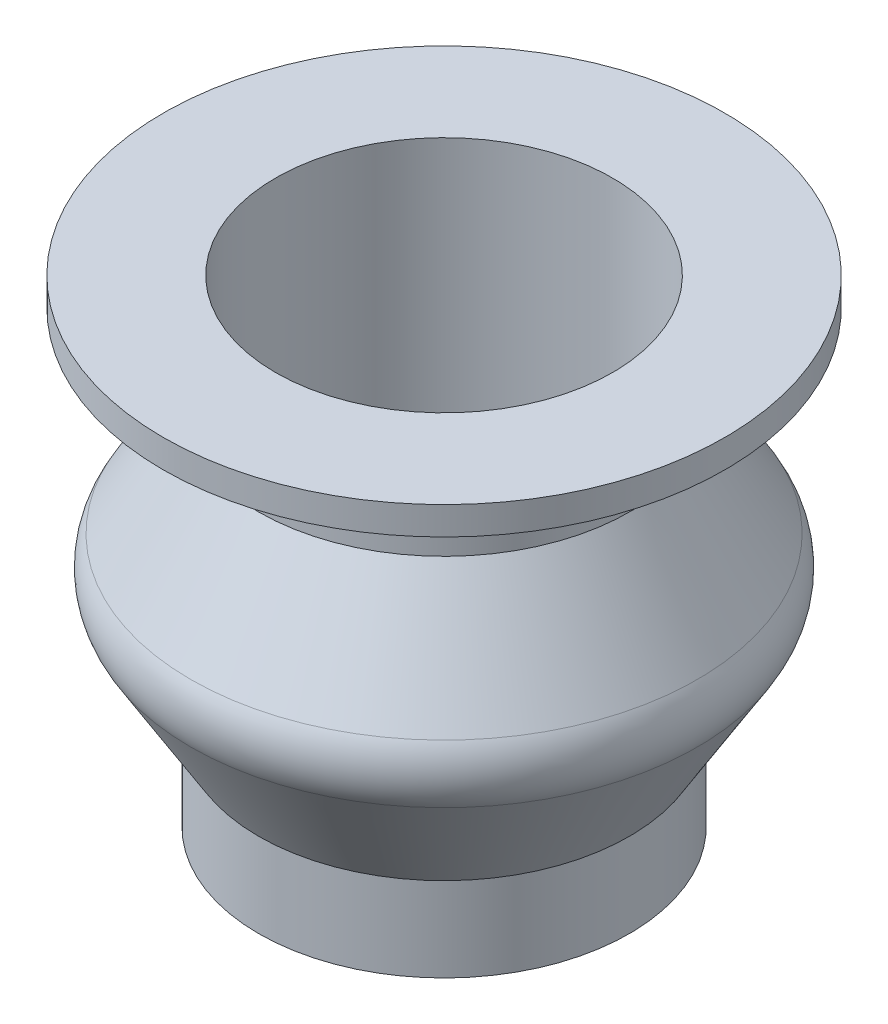
ISO-10303-21;
HEADER;
FILE_DESCRIPTION(('STEP AP214'),'2;1');
FILE_NAME('part.step','',(''),(''),'','','');
FILE_SCHEMA(('AUTOMOTIVE_DESIGN { 1 0 10303 214 1 1 1 1 }'));
ENDSEC;
DATA;
#1=APPLICATION_CONTEXT('core data for automotive mechanical design processes');
#2=APPLICATION_PROTOCOL_DEFINITION('international standard','automotive_design',2000,#1);
#3=PRODUCT_CONTEXT('',#1,'mechanical');
#4=PRODUCT('Part','Part','',(#3));
#5=PRODUCT_RELATED_PRODUCT_CATEGORY('part','',(#4));
#6=PRODUCT_DEFINITION_FORMATION('','',#4);
#7=PRODUCT_DEFINITION_CONTEXT('part definition',#1,'design');
#8=PRODUCT_DEFINITION('design','',#6,#7);
#9=PRODUCT_DEFINITION_SHAPE('','',#8);
#10=(LENGTH_UNIT() NAMED_UNIT(*) SI_UNIT(.MILLI.,.METRE.));
#11=(NAMED_UNIT(*) PLANE_ANGLE_UNIT() SI_UNIT($,.RADIAN.));
#12=(NAMED_UNIT(*) SI_UNIT($,.STERADIAN.) SOLID_ANGLE_UNIT());
#13=UNCERTAINTY_MEASURE_WITH_UNIT(LENGTH_MEASURE(1.E-05),#10,'distance_accuracy_value','');
#14=(GEOMETRIC_REPRESENTATION_CONTEXT(3) GLOBAL_UNCERTAINTY_ASSIGNED_CONTEXT((#13)) GLOBAL_UNIT_ASSIGNED_CONTEXT((#10,
#11,#12)) REPRESENTATION_CONTEXT('',''));
#15=CARTESIAN_POINT('',(0.,0.,0.));
#16=DIRECTION('',(0.,0.,1.));
#17=DIRECTION('',(1.,0.,0.));
#18=AXIS2_PLACEMENT_3D('',#15,#16,#17);
#19=CARTESIAN_POINT('',(-33.,-40.,0.));
#20=DIRECTION('',(0.,-1.,0.));
#21=DIRECTION('',(0.,0.,-1.));
#22=AXIS2_PLACEMENT_3D('',#19,#20,#21);
#23=PLANE('',#22);
#24=CARTESIAN_POINT('',(0.,-40.,0.));
#25=DIRECTION('',(0.,1.,0.));
#26=DIRECTION('',(0.,0.,1.));
#27=AXIS2_PLACEMENT_3D('',#24,#25,#26);
#28=CIRCLE('',#27,30.);
#29=CARTESIAN_POINT('',(0.,-40.,30.));
#30=VERTEX_POINT('',#29);
#31=EDGE_CURVE('E84',#30,#30,#28,.T.);
#32=ORIENTED_EDGE('',*,*,#31,.T.);
#33=EDGE_LOOP('',(#32));
#34=FACE_BOUND('',#33,.T.);
#35=CARTESIAN_POINT('',(0.,-40.,0.));
#36=DIRECTION('',(0.,1.,0.));
#37=DIRECTION('',(0.,0.,1.));
#38=AXIS2_PLACEMENT_3D('',#35,#36,#37);
#39=CIRCLE('',#38,33.);
#40=CARTESIAN_POINT('',(0.,-40.,33.));
#41=VERTEX_POINT('',#40);
#42=EDGE_CURVE('E10',#41,#41,#39,.T.);
#43=ORIENTED_EDGE('',*,*,#42,.F.);
#44=EDGE_LOOP('',(#43));
#45=FACE_BOUND('',#44,.T.);
#46=ADVANCED_FACE('F37',(#34,#45),#23,.T.);
#47=CARTESIAN_POINT('',(0.,78.932584269663,0.));
#48=DIRECTION('',(0.,1.,0.));
#49=DIRECTION('',(0.,0.,1.));
#50=AXIS2_PLACEMENT_3D('',#47,#48,#49);
#51=CYLINDRICAL_SURFACE('',#50,33.);
#52=ORIENTED_EDGE('',*,*,#42,.T.);
#53=EDGE_LOOP('',(#52));
#54=FACE_BOUND('',#53,.T.);
#55=CARTESIAN_POINT('',(0.,-25.,0.));
#56=DIRECTION('',(0.,1.,0.));
#57=DIRECTION('',(0.,0.,1.));
#58=AXIS2_PLACEMENT_3D('',#55,#56,#57);
#59=CIRCLE('',#58,33.);
#60=CARTESIAN_POINT('',(0.,-25.,33.));
#61=VERTEX_POINT('',#60);
#62=EDGE_CURVE('E44',#61,#61,#59,.T.);
#63=ORIENTED_EDGE('',*,*,#62,.F.);
#64=EDGE_LOOP('',(#63));
#65=FACE_BOUND('',#64,.T.);
#66=ADVANCED_FACE('F113',(#54,#65),#51,.T.);
#67=CARTESIAN_POINT('',(0.,-5.20776982101394,0.));
#68=DIRECTION('',(0.,1.,0.));
#69=DIRECTION('',(0.,0.,1.));
#70=AXIS2_PLACEMENT_3D('',#67,#68,#69);
#71=CONICAL_SURFACE('',#70,45.073826016926,0.547760840841325);
#72=ORIENTED_EDGE('',*,*,#62,.T.);
#73=EDGE_LOOP('',(#72));
#74=FACE_BOUND('',#73,.T.);
#75=CARTESIAN_POINT('',(0.,-5.20776982101394,0.));
#76=DIRECTION('',(0.,1.,0.));
#77=DIRECTION('',(0.,0.,1.));
#78=AXIS2_PLACEMENT_3D('',#75,#76,#77);
#79=CIRCLE('',#78,45.073826016926);
#80=CARTESIAN_POINT('',(0.,-5.20776982101394,45.073826016926));
#81=VERTEX_POINT('',#80);
#82=EDGE_CURVE('E49',#81,#81,#79,.T.);
#83=ORIENTED_EDGE('',*,*,#82,.F.);
#84=EDGE_LOOP('',(#83));
#85=FACE_BOUND('',#84,.T.);
#86=ADVANCED_FACE('F118',(#74,#85),#71,.T.);
#87=CARTESIAN_POINT('',(0.,0.,0.));
#88=DIRECTION('',(0.,1.,0.));
#89=DIRECTION('',(0.,0.,1.));
#90=AXIS2_PLACEMENT_3D('',#87,#88,#89);
#91=TOROIDAL_SURFACE('',#90,36.5368983792254,10.);
#92=ORIENTED_EDGE('',*,*,#82,.T.);
#93=EDGE_LOOP('',(#92));
#94=FACE_BOUND('',#93,.T.);
#95=CARTESIAN_POINT('',(0.,5.20776982101394,0.));
#96=DIRECTION('',(0.,1.,0.));
#97=DIRECTION('',(0.,0.,1.));
#98=AXIS2_PLACEMENT_3D('',#95,#96,#97);
#99=CIRCLE('',#98,45.073826016926);
#100=CARTESIAN_POINT('',(0.,5.20776982101394,45.073826016926));
#101=VERTEX_POINT('',#100);
#102=EDGE_CURVE('E54',#101,#101,#99,.T.);
#103=ORIENTED_EDGE('',*,*,#102,.F.);
#104=EDGE_LOOP('',(#103));
#105=FACE_BOUND('',#104,.T.);
#106=ADVANCED_FACE('F184',(#94,#105),#91,.T.);
#107=CARTESIAN_POINT('',(0.,25.,0.));
#108=DIRECTION('',(0.,-1.,0.));
#109=DIRECTION('',(0.,0.,-1.));
#110=AXIS2_PLACEMENT_3D('',#107,#108,#109);
#111=CONICAL_SURFACE('',#110,33.,0.547760840841325);
#112=ORIENTED_EDGE('',*,*,#102,.T.);
#113=EDGE_LOOP('',(#112));
#114=FACE_BOUND('',#113,.T.);
#115=CARTESIAN_POINT('',(0.,25.,0.));
#116=DIRECTION('',(0.,1.,0.));
#117=DIRECTION('',(0.,0.,1.));
#118=AXIS2_PLACEMENT_3D('',#115,#116,#117);
#119=CIRCLE('',#118,33.);
#120=CARTESIAN_POINT('',(0.,25.,33.));
#121=VERTEX_POINT('',#120);
#122=EDGE_CURVE('E60',#121,#121,#119,.T.);
#123=ORIENTED_EDGE('',*,*,#122,.F.);
#124=EDGE_LOOP('',(#123));
#125=FACE_BOUND('',#124,.T.);
#126=ADVANCED_FACE('F174',(#114,#125),#111,.T.);
#127=CARTESIAN_POINT('',(0.,78.932584269663,0.));
#128=DIRECTION('',(0.,1.,0.));
#129=DIRECTION('',(0.,0.,1.));
#130=AXIS2_PLACEMENT_3D('',#127,#128,#129);
#131=CYLINDRICAL_SURFACE('',#130,33.);
#132=ORIENTED_EDGE('',*,*,#122,.T.);
#133=EDGE_LOOP('',(#132));
#134=FACE_BOUND('',#133,.T.);
#135=CARTESIAN_POINT('',(0.,35.,0.));
#136=DIRECTION('',(0.,1.,0.));
#137=DIRECTION('',(0.,0.,1.));
#138=AXIS2_PLACEMENT_3D('',#135,#136,#137);
#139=CIRCLE('',#138,33.);
#140=CARTESIAN_POINT('',(0.,35.,33.));
#141=VERTEX_POINT('',#140);
#142=EDGE_CURVE('E64',#141,#141,#139,.T.);
#143=ORIENTED_EDGE('',*,*,#142,.F.);
#144=EDGE_LOOP('',(#143));
#145=FACE_BOUND('',#144,.T.);
#146=ADVANCED_FACE('F164',(#134,#145),#131,.T.);
#147=CARTESIAN_POINT('',(-35.,35.,0.));
#148=DIRECTION('',(0.,-1.,0.));
#149=DIRECTION('',(0.,0.,-1.));
#150=AXIS2_PLACEMENT_3D('',#147,#148,#149);
#151=PLANE('',#150);
#152=ORIENTED_EDGE('',*,*,#142,.T.);
#153=EDGE_LOOP('',(#152));
#154=FACE_BOUND('',#153,.T.);
#155=CARTESIAN_POINT('',(0.,35.,0.));
#156=DIRECTION('',(0.,1.,0.));
#157=DIRECTION('',(0.,0.,1.));
#158=AXIS2_PLACEMENT_3D('',#155,#156,#157);
#159=CIRCLE('',#158,35.);
#160=CARTESIAN_POINT('',(0.,35.,35.));
#161=VERTEX_POINT('',#160);
#162=EDGE_CURVE('E68',#161,#161,#159,.T.);
#163=ORIENTED_EDGE('',*,*,#162,.F.);
#164=EDGE_LOOP('',(#163));
#165=FACE_BOUND('',#164,.T.);
#166=ADVANCED_FACE('F154',(#154,#165),#151,.T.);
#167=CARTESIAN_POINT('',(0.,78.932584269663,0.));
#168=DIRECTION('',(0.,1.,0.));
#169=DIRECTION('',(0.,0.,1.));
#170=AXIS2_PLACEMENT_3D('',#167,#168,#169);
#171=CYLINDRICAL_SURFACE('',#170,35.);
#172=ORIENTED_EDGE('',*,*,#162,.T.);
#173=EDGE_LOOP('',(#172));
#174=FACE_BOUND('',#173,.T.);
#175=CARTESIAN_POINT('',(0.,40.,0.));
#176=DIRECTION('',(0.,1.,0.));
#177=DIRECTION('',(0.,0.,1.));
#178=AXIS2_PLACEMENT_3D('',#175,#176,#177);
#179=CIRCLE('',#178,35.);
#180=CARTESIAN_POINT('',(0.,40.,35.));
#181=VERTEX_POINT('',#180);
#182=EDGE_CURVE('E72',#181,#181,#179,.T.);
#183=ORIENTED_EDGE('',*,*,#182,.F.);
#184=EDGE_LOOP('',(#183));
#185=FACE_BOUND('',#184,.T.);
#186=ADVANCED_FACE('F109',(#174,#185),#171,.T.);
#187=CARTESIAN_POINT('',(-50.,40.,0.));
#188=DIRECTION('',(0.,-1.,0.));
#189=DIRECTION('',(0.,0.,-1.));
#190=AXIS2_PLACEMENT_3D('',#187,#188,#189);
#191=PLANE('',#190);
#192=ORIENTED_EDGE('',*,*,#182,.T.);
#193=EDGE_LOOP('',(#192));
#194=FACE_BOUND('',#193,.T.);
#195=CARTESIAN_POINT('',(0.,40.,0.));
#196=DIRECTION('',(0.,1.,0.));
#197=DIRECTION('',(0.,0.,1.));
#198=AXIS2_PLACEMENT_3D('',#195,#196,#197);
#199=CIRCLE('',#198,50.);
#200=CARTESIAN_POINT('',(0.,40.,50.));
#201=VERTEX_POINT('',#200);
#202=EDGE_CURVE('E76',#201,#201,#199,.T.);
#203=ORIENTED_EDGE('',*,*,#202,.F.);
#204=EDGE_LOOP('',(#203));
#205=FACE_BOUND('',#204,.T.);
#206=ADVANCED_FACE('F103',(#194,#205),#191,.T.);
#207=CARTESIAN_POINT('',(0.,78.932584269663,0.));
#208=DIRECTION('',(0.,1.,0.));
#209=DIRECTION('',(0.,0.,1.));
#210=AXIS2_PLACEMENT_3D('',#207,#208,#209);
#211=CYLINDRICAL_SURFACE('',#210,50.);
#212=ORIENTED_EDGE('',*,*,#202,.T.);
#213=EDGE_LOOP('',(#212));
#214=FACE_BOUND('',#213,.T.);
#215=CARTESIAN_POINT('',(0.,45.,0.));
#216=DIRECTION('',(0.,1.,0.));
#217=DIRECTION('',(0.,0.,1.));
#218=AXIS2_PLACEMENT_3D('',#215,#216,#217);
#219=CIRCLE('',#218,50.);
#220=CARTESIAN_POINT('',(0.,45.,50.));
#221=VERTEX_POINT('',#220);
#222=EDGE_CURVE('E80',#221,#221,#219,.T.);
#223=ORIENTED_EDGE('',*,*,#222,.F.);
#224=EDGE_LOOP('',(#223));
#225=FACE_BOUND('',#224,.T.);
#226=ADVANCED_FACE('F98',(#214,#225),#211,.T.);
#227=CARTESIAN_POINT('',(0.,45.,0.));
#228=DIRECTION('',(0.,1.,0.));
#229=DIRECTION('',(0.,0.,1.));
#230=AXIS2_PLACEMENT_3D('',#227,#228,#229);
#231=PLANE('',#230);
#232=CARTESIAN_POINT('',(0.,45.,0.));
#233=DIRECTION('',(0.,1.,0.));
#234=DIRECTION('',(0.,0.,1.));
#235=AXIS2_PLACEMENT_3D('',#232,#233,#234);
#236=CIRCLE('',#235,30.);
#237=CARTESIAN_POINT('',(0.,45.,30.));
#238=VERTEX_POINT('',#237);
#239=EDGE_CURVE('E88',#238,#238,#236,.T.);
#240=ORIENTED_EDGE('',*,*,#239,.F.);
#241=EDGE_LOOP('',(#240));
#242=FACE_BOUND('',#241,.T.);
#243=ORIENTED_EDGE('',*,*,#222,.T.);
#244=EDGE_LOOP('',(#243));
#245=FACE_BOUND('',#244,.T.);
#246=ADVANCED_FACE('F95',(#242,#245),#231,.T.);
#247=CARTESIAN_POINT('',(0.,-40.,0.));
#248=DIRECTION('',(0.,1.,0.));
#249=DIRECTION('',(0.,0.,1.));
#250=AXIS2_PLACEMENT_3D('',#247,#248,#249);
#251=CYLINDRICAL_SURFACE('',#250,30.);
#252=ORIENTED_EDGE('',*,*,#31,.F.);
#253=EDGE_LOOP('',(#252));
#254=FACE_BOUND('',#253,.T.);
#255=ORIENTED_EDGE('',*,*,#239,.T.);
#256=EDGE_LOOP('',(#255));
#257=FACE_BOUND('',#256,.T.);
#258=ADVANCED_FACE('F93',(#254,#257),#251,.F.);
#259=CLOSED_SHELL('',(#46,#66,#86,#106,#126,#146,#166,#186,#206,#226,#246,#258));
#260=MANIFOLD_SOLID_BREP('B2',#259);
#261=ADVANCED_BREP_SHAPE_REPRESENTATION('',(#18,#260),#14);
#262=SHAPE_DEFINITION_REPRESENTATION(#9,#261);
ENDSEC;
END-ISO-10303-21;
